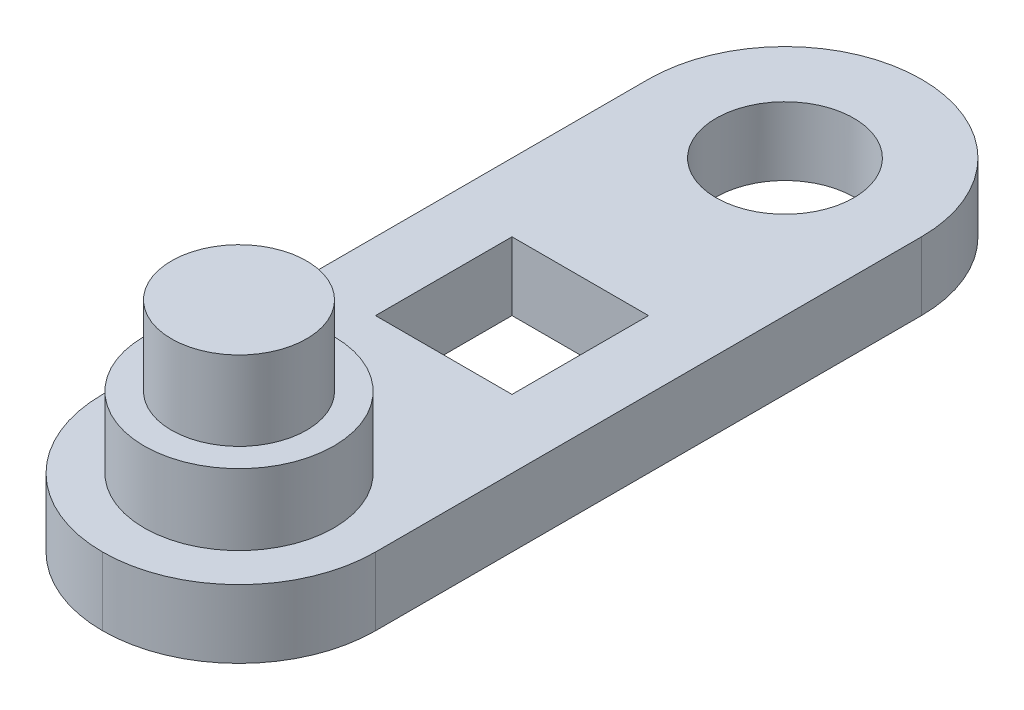
ISO-10303-21;
HEADER;
FILE_DESCRIPTION(('STEP AP214'),'2;1');
FILE_NAME('part.step','',(''),(''),'','','');
FILE_SCHEMA(('AUTOMOTIVE_DESIGN { 1 0 10303 214 1 1 1 1 }'));
ENDSEC;
DATA;
#1=APPLICATION_CONTEXT('core data for automotive mechanical design processes');
#2=APPLICATION_PROTOCOL_DEFINITION('international standard','automotive_design',2000,#1);
#3=PRODUCT_CONTEXT('',#1,'mechanical');
#4=PRODUCT('Part','Part','',(#3));
#5=PRODUCT_RELATED_PRODUCT_CATEGORY('part','',(#4));
#6=PRODUCT_DEFINITION_FORMATION('','',#4);
#7=PRODUCT_DEFINITION_CONTEXT('part definition',#1,'design');
#8=PRODUCT_DEFINITION('design','',#6,#7);
#9=PRODUCT_DEFINITION_SHAPE('','',#8);
#10=(LENGTH_UNIT() NAMED_UNIT(*) SI_UNIT(.MILLI.,.METRE.));
#11=(NAMED_UNIT(*) PLANE_ANGLE_UNIT() SI_UNIT($,.RADIAN.));
#12=(NAMED_UNIT(*) SI_UNIT($,.STERADIAN.) SOLID_ANGLE_UNIT());
#13=UNCERTAINTY_MEASURE_WITH_UNIT(LENGTH_MEASURE(1.E-05),#10,'distance_accuracy_value','');
#14=(GEOMETRIC_REPRESENTATION_CONTEXT(3) GLOBAL_UNCERTAINTY_ASSIGNED_CONTEXT((#13)) GLOBAL_UNIT_ASSIGNED_CONTEXT((#10,
#11,#12)) REPRESENTATION_CONTEXT('',''));
#15=CARTESIAN_POINT('',(0.,0.,0.));
#16=DIRECTION('',(0.,0.,1.));
#17=DIRECTION('',(1.,0.,0.));
#18=AXIS2_PLACEMENT_3D('',#15,#16,#17);
#19=CARTESIAN_POINT('',(-23.3333333333333,5.,-28.974358974359));
#20=DIRECTION('',(1.,0.,0.));
#21=DIRECTION('',(0.,0.,-1.));
#22=AXIS2_PLACEMENT_3D('',#19,#20,#21);
#23=PLANE('',#22);
#24=DIRECTION('',(0.,0.,1.));
#25=VECTOR('',#24,1.);
#26=CARTESIAN_POINT('',(-23.3333333333333,5.,-28.974358974359));
#27=LINE('',#26,#25);
#28=CARTESIAN_POINT('',(-23.3333333333333,5.,-18.974358974359));
#29=VERTEX_POINT('',#28);
#30=CARTESIAN_POINT('',(-23.3333333333333,5.,21.025641025641));
#31=VERTEX_POINT('',#30);
#32=EDGE_CURVE('E157',#29,#31,#27,.T.);
#33=ORIENTED_EDGE('',*,*,#32,.F.);
#34=DIRECTION('',(0.,-1.,0.));
#35=VECTOR('',#34,1.);
#36=CARTESIAN_POINT('',(-23.3333333333333,5.,-18.974358974359));
#37=LINE('',#36,#35);
#38=CARTESIAN_POINT('',(-23.3333333333333,0.,-18.974358974359));
#39=VERTEX_POINT('',#38);
#40=EDGE_CURVE('E173',#29,#39,#37,.T.);
#41=ORIENTED_EDGE('',*,*,#40,.T.);
#42=DIRECTION('',(0.,0.,1.));
#43=VECTOR('',#42,1.);
#44=CARTESIAN_POINT('',(-23.3333333333333,0.,-28.974358974359));
#45=LINE('',#44,#43);
#46=CARTESIAN_POINT('',(-23.3333333333333,0.,21.025641025641));
#47=VERTEX_POINT('',#46);
#48=EDGE_CURVE('E165',#39,#47,#45,.T.);
#49=ORIENTED_EDGE('',*,*,#48,.T.);
#50=DIRECTION('',(0.,-1.,0.));
#51=VECTOR('',#50,1.);
#52=CARTESIAN_POINT('',(-23.3333333333333,5.,21.025641025641));
#53=LINE('',#52,#51);
#54=EDGE_CURVE('E164',#47,#31,#53,.F.);
#55=ORIENTED_EDGE('',*,*,#54,.T.);
#56=EDGE_LOOP('',(#33,#41,#49,#55));
#57=FACE_BOUND('',#56,.T.);
#58=ADVANCED_FACE('F33',(#57),#23,.F.);
#59=CARTESIAN_POINT('',(-3.33333333333331,5.,-28.974358974359));
#60=DIRECTION('',(-1.,0.,0.));
#61=DIRECTION('',(0.,0.,1.));
#62=AXIS2_PLACEMENT_3D('',#59,#60,#61);
#63=PLANE('',#62);
#64=DIRECTION('',(0.,0.,-1.));
#65=VECTOR('',#64,1.);
#66=CARTESIAN_POINT('',(-3.33333333333331,0.,-28.974358974359));
#67=LINE('',#66,#65);
#68=CARTESIAN_POINT('',(-3.3333333333333,0.,21.025641025641));
#69=VERTEX_POINT('',#68);
#70=CARTESIAN_POINT('',(-3.33333333333331,0.,-18.974358974359));
#71=VERTEX_POINT('',#70);
#72=EDGE_CURVE('E161',#69,#71,#67,.T.);
#73=ORIENTED_EDGE('',*,*,#72,.T.);
#74=DIRECTION('',(0.,-1.,0.));
#75=VECTOR('',#74,1.);
#76=CARTESIAN_POINT('',(-3.33333333333331,5.,-18.974358974359));
#77=LINE('',#76,#75);
#78=CARTESIAN_POINT('',(-3.33333333333331,5.,-18.974358974359));
#79=VERTEX_POINT('',#78);
#80=EDGE_CURVE('E41',#71,#79,#77,.F.);
#81=ORIENTED_EDGE('',*,*,#80,.T.);
#82=DIRECTION('',(0.,0.,-1.));
#83=VECTOR('',#82,1.);
#84=CARTESIAN_POINT('',(-3.33333333333331,5.,-28.974358974359));
#85=LINE('',#84,#83);
#86=CARTESIAN_POINT('',(-3.3333333333333,5.,21.025641025641));
#87=VERTEX_POINT('',#86);
#88=EDGE_CURVE('E160',#87,#79,#85,.T.);
#89=ORIENTED_EDGE('',*,*,#88,.F.);
#90=DIRECTION('',(0.,-1.,0.));
#91=VECTOR('',#90,1.);
#92=CARTESIAN_POINT('',(-3.3333333333333,5.,21.025641025641));
#93=LINE('',#92,#91);
#94=EDGE_CURVE('E192',#87,#69,#93,.T.);
#95=ORIENTED_EDGE('',*,*,#94,.T.);
#96=EDGE_LOOP('',(#73,#81,#89,#95));
#97=FACE_BOUND('',#96,.T.);
#98=ADVANCED_FACE('F224',(#97),#63,.F.);
#99=CARTESIAN_POINT('',(0.,5.,0.));
#100=DIRECTION('',(0.,-1.,0.));
#101=DIRECTION('',(0.,0.,-1.));
#102=AXIS2_PLACEMENT_3D('',#99,#100,#101);
#103=PLANE('',#102);
#104=CARTESIAN_POINT('',(-13.3333333333333,5.,21.025641025641));
#105=DIRECTION('',(0.,-1.,0.));
#106=DIRECTION('',(0.,0.,-1.));
#107=AXIS2_PLACEMENT_3D('',#104,#105,#106);
#108=CIRCLE('',#107,6.95);
#109=CARTESIAN_POINT('',(-13.3333333333333,5.,14.075641025641));
#110=VERTEX_POINT('',#109);
#111=EDGE_CURVE('E11',#110,#110,#108,.F.);
#112=ORIENTED_EDGE('',*,*,#111,.F.);
#113=EDGE_LOOP('',(#112));
#114=FACE_BOUND('',#113,.T.);
#115=DIRECTION('',(0.,0.,-1.));
#116=VECTOR('',#115,1.);
#117=CARTESIAN_POINT('',(-8.3333333333333,5.,-3.97435897435897));
#118=LINE('',#117,#116);
#119=CARTESIAN_POINT('',(-8.33333333333329,5.,6.02564102564103));
#120=VERTEX_POINT('',#119);
#121=CARTESIAN_POINT('',(-8.3333333333333,5.,-3.97435897435897));
#122=VERTEX_POINT('',#121);
#123=EDGE_CURVE('E134',#120,#122,#118,.T.);
#124=ORIENTED_EDGE('',*,*,#123,.F.);
#125=DIRECTION('',(1.,0.,0.));
#126=VECTOR('',#125,1.);
#127=CARTESIAN_POINT('',(-18.3333333333333,5.,6.02564102564103));
#128=LINE('',#127,#126);
#129=CARTESIAN_POINT('',(-18.3333333333333,5.,6.02564102564103));
#130=VERTEX_POINT('',#129);
#131=EDGE_CURVE('E127',#130,#120,#128,.T.);
#132=ORIENTED_EDGE('',*,*,#131,.F.);
#133=DIRECTION('',(0.,0.,1.));
#134=VECTOR('',#133,1.);
#135=CARTESIAN_POINT('',(-18.3333333333333,5.,-3.97435897435897));
#136=LINE('',#135,#134);
#137=CARTESIAN_POINT('',(-18.3333333333333,5.,-3.97435897435897));
#138=VERTEX_POINT('',#137);
#139=EDGE_CURVE('E138',#138,#130,#136,.T.);
#140=ORIENTED_EDGE('',*,*,#139,.F.);
#141=DIRECTION('',(-1.,0.,0.));
#142=VECTOR('',#141,1.);
#143=CARTESIAN_POINT('',(-18.3333333333333,5.,-3.97435897435897));
#144=LINE('',#143,#142);
#145=EDGE_CURVE('E48',#122,#138,#144,.T.);
#146=ORIENTED_EDGE('',*,*,#145,.F.);
#147=EDGE_LOOP('',(#124,#132,#140,#146));
#148=FACE_BOUND('',#147,.T.);
#149=CARTESIAN_POINT('',(-13.3333333333333,5.,-18.974358974359));
#150=DIRECTION('',(0.,1.,0.));
#151=DIRECTION('',(0.,0.,1.));
#152=AXIS2_PLACEMENT_3D('',#149,#150,#151);
#153=CIRCLE('',#152,5.05);
#154=CARTESIAN_POINT('',(-13.3333333333333,5.,-13.924358974359));
#155=VERTEX_POINT('',#154);
#156=EDGE_CURVE('E147',#155,#155,#153,.T.);
#157=ORIENTED_EDGE('',*,*,#156,.F.);
#158=EDGE_LOOP('',(#157));
#159=FACE_BOUND('',#158,.T.);
#160=CARTESIAN_POINT('',(-13.3333333333333,5.,-18.974358974359));
#161=DIRECTION('',(0.,-1.,0.));
#162=DIRECTION('',(0.,0.,-1.));
#163=AXIS2_PLACEMENT_3D('',#160,#161,#162);
#164=CIRCLE('',#163,10.);
#165=CARTESIAN_POINT('',(-13.3333333333333,5.,-28.974358974359));
#166=VERTEX_POINT('',#165);
#167=EDGE_CURVE('E188',#79,#166,#164,.F.);
#168=ORIENTED_EDGE('',*,*,#167,.T.);
#169=CARTESIAN_POINT('',(-13.3333333333333,5.,-18.974358974359));
#170=DIRECTION('',(0.,-1.,0.));
#171=DIRECTION('',(0.,0.,-1.));
#172=AXIS2_PLACEMENT_3D('',#169,#170,#171);
#173=CIRCLE('',#172,10.);
#174=EDGE_CURVE('E190',#166,#29,#173,.F.);
#175=ORIENTED_EDGE('',*,*,#174,.T.);
#176=ORIENTED_EDGE('',*,*,#32,.T.);
#177=CARTESIAN_POINT('',(-13.3333333333333,5.,21.025641025641));
#178=DIRECTION('',(0.,-1.,0.));
#179=DIRECTION('',(0.,0.,-1.));
#180=AXIS2_PLACEMENT_3D('',#177,#178,#179);
#181=CIRCLE('',#180,10.);
#182=CARTESIAN_POINT('',(-13.3333333333333,5.,31.025641025641));
#183=VERTEX_POINT('',#182);
#184=EDGE_CURVE('E186',#31,#183,#181,.F.);
#185=ORIENTED_EDGE('',*,*,#184,.T.);
#186=CARTESIAN_POINT('',(-13.3333333333333,5.,21.025641025641));
#187=DIRECTION('',(0.,-1.,0.));
#188=DIRECTION('',(0.,0.,-1.));
#189=AXIS2_PLACEMENT_3D('',#186,#187,#188);
#190=CIRCLE('',#189,10.);
#191=EDGE_CURVE('E184',#183,#87,#190,.F.);
#192=ORIENTED_EDGE('',*,*,#191,.T.);
#193=ORIENTED_EDGE('',*,*,#88,.T.);
#194=EDGE_LOOP('',(#168,#175,#176,#185,#192,#193));
#195=FACE_BOUND('',#194,.T.);
#196=ADVANCED_FACE('F210',(#114,#148,#159,#195),#103,.F.);
#197=CARTESIAN_POINT('',(0.,0.,0.));
#198=DIRECTION('',(0.,-1.,0.));
#199=DIRECTION('',(0.,0.,-1.));
#200=AXIS2_PLACEMENT_3D('',#197,#198,#199);
#201=PLANE('',#200);
#202=DIRECTION('',(1.,0.,0.));
#203=VECTOR('',#202,1.);
#204=CARTESIAN_POINT('',(-18.3333333333333,0.,6.02564102564103));
#205=LINE('',#204,#203);
#206=CARTESIAN_POINT('',(-18.3333333333333,0.,6.02564102564103));
#207=VERTEX_POINT('',#206);
#208=CARTESIAN_POINT('',(-8.33333333333329,0.,6.02564102564103));
#209=VERTEX_POINT('',#208);
#210=EDGE_CURVE('E124',#207,#209,#205,.T.);
#211=ORIENTED_EDGE('',*,*,#210,.T.);
#212=DIRECTION('',(0.,0.,-1.));
#213=VECTOR('',#212,1.);
#214=CARTESIAN_POINT('',(-8.3333333333333,0.,-3.97435897435897));
#215=LINE('',#214,#213);
#216=CARTESIAN_POINT('',(-8.3333333333333,0.,-3.97435897435897));
#217=VERTEX_POINT('',#216);
#218=EDGE_CURVE('E111',#209,#217,#215,.T.);
#219=ORIENTED_EDGE('',*,*,#218,.T.);
#220=DIRECTION('',(-1.,0.,0.));
#221=VECTOR('',#220,1.);
#222=CARTESIAN_POINT('',(-18.3333333333333,0.,-3.97435897435897));
#223=LINE('',#222,#221);
#224=CARTESIAN_POINT('',(-18.3333333333333,0.,-3.97435897435897));
#225=VERTEX_POINT('',#224);
#226=EDGE_CURVE('E142',#217,#225,#223,.T.);
#227=ORIENTED_EDGE('',*,*,#226,.T.);
#228=DIRECTION('',(0.,0.,1.));
#229=VECTOR('',#228,1.);
#230=CARTESIAN_POINT('',(-18.3333333333333,0.,-3.97435897435897));
#231=LINE('',#230,#229);
#232=EDGE_CURVE('E132',#225,#207,#231,.T.);
#233=ORIENTED_EDGE('',*,*,#232,.T.);
#234=EDGE_LOOP('',(#211,#219,#227,#233));
#235=FACE_BOUND('',#234,.T.);
#236=CARTESIAN_POINT('',(-13.3333333333333,0.,-18.974358974359));
#237=DIRECTION('',(0.,-1.,0.));
#238=DIRECTION('',(0.,0.,-1.));
#239=AXIS2_PLACEMENT_3D('',#236,#237,#238);
#240=CIRCLE('',#239,5.05);
#241=CARTESIAN_POINT('',(-13.3333333333333,0.,-24.024358974359));
#242=VERTEX_POINT('',#241);
#243=EDGE_CURVE('E150',#242,#242,#240,.F.);
#244=ORIENTED_EDGE('',*,*,#243,.T.);
#245=EDGE_LOOP('',(#244));
#246=FACE_BOUND('',#245,.T.);
#247=ORIENTED_EDGE('',*,*,#48,.F.);
#248=CARTESIAN_POINT('',(-13.3333333333333,0.,-18.974358974359));
#249=DIRECTION('',(0.,-1.,0.));
#250=DIRECTION('',(0.,0.,-1.));
#251=AXIS2_PLACEMENT_3D('',#248,#249,#250);
#252=CIRCLE('',#251,10.);
#253=CARTESIAN_POINT('',(-13.3333333333333,0.,-28.974358974359));
#254=VERTEX_POINT('',#253);
#255=EDGE_CURVE('E182',#39,#254,#252,.T.);
#256=ORIENTED_EDGE('',*,*,#255,.T.);
#257=CARTESIAN_POINT('',(-13.3333333333333,0.,-18.974358974359));
#258=DIRECTION('',(0.,-1.,0.));
#259=DIRECTION('',(0.,0.,-1.));
#260=AXIS2_PLACEMENT_3D('',#257,#258,#259);
#261=CIRCLE('',#260,10.);
#262=EDGE_CURVE('E180',#254,#71,#261,.T.);
#263=ORIENTED_EDGE('',*,*,#262,.T.);
#264=ORIENTED_EDGE('',*,*,#72,.F.);
#265=CARTESIAN_POINT('',(-13.3333333333333,0.,21.025641025641));
#266=DIRECTION('',(0.,-1.,0.));
#267=DIRECTION('',(0.,0.,-1.));
#268=AXIS2_PLACEMENT_3D('',#265,#266,#267);
#269=CIRCLE('',#268,10.);
#270=CARTESIAN_POINT('',(-13.3333333333333,0.,31.025641025641));
#271=VERTEX_POINT('',#270);
#272=EDGE_CURVE('E176',#69,#271,#269,.T.);
#273=ORIENTED_EDGE('',*,*,#272,.T.);
#274=CARTESIAN_POINT('',(-13.3333333333333,0.,21.025641025641));
#275=DIRECTION('',(0.,-1.,0.));
#276=DIRECTION('',(0.,0.,-1.));
#277=AXIS2_PLACEMENT_3D('',#274,#275,#276);
#278=CIRCLE('',#277,10.);
#279=EDGE_CURVE('E178',#271,#47,#278,.T.);
#280=ORIENTED_EDGE('',*,*,#279,.T.);
#281=EDGE_LOOP('',(#247,#256,#263,#264,#273,#280));
#282=FACE_BOUND('',#281,.T.);
#283=ADVANCED_FACE('F130',(#235,#246,#282),#201,.T.);
#284=CARTESIAN_POINT('',(-13.3333333333333,5.,-18.974358974359));
#285=DIRECTION('',(0.,-1.,0.));
#286=DIRECTION('',(0.,0.,-1.));
#287=AXIS2_PLACEMENT_3D('',#284,#285,#286);
#288=CYLINDRICAL_SURFACE('',#287,10.);
#289=DIRECTION('',(0.,-1.,0.));
#290=VECTOR('',#289,1.);
#291=CARTESIAN_POINT('',(-13.3333333333333,5.,-28.974358974359));
#292=LINE('',#291,#290);
#293=EDGE_CURVE('E168',#166,#254,#292,.T.);
#294=ORIENTED_EDGE('',*,*,#293,.F.);
#295=ORIENTED_EDGE('',*,*,#167,.F.);
#296=ORIENTED_EDGE('',*,*,#80,.F.);
#297=ORIENTED_EDGE('',*,*,#262,.F.);
#298=EDGE_LOOP('',(#294,#295,#296,#297));
#299=FACE_BOUND('',#298,.T.);
#300=ADVANCED_FACE('F238',(#299),#288,.T.);
#301=CARTESIAN_POINT('',(-13.3333333333333,5.,-18.974358974359));
#302=DIRECTION('',(0.,-1.,0.));
#303=DIRECTION('',(0.,0.,-1.));
#304=AXIS2_PLACEMENT_3D('',#301,#302,#303);
#305=CYLINDRICAL_SURFACE('',#304,10.);
#306=ORIENTED_EDGE('',*,*,#174,.F.);
#307=ORIENTED_EDGE('',*,*,#293,.T.);
#308=ORIENTED_EDGE('',*,*,#255,.F.);
#309=ORIENTED_EDGE('',*,*,#40,.F.);
#310=EDGE_LOOP('',(#306,#307,#308,#309));
#311=FACE_BOUND('',#310,.T.);
#312=ADVANCED_FACE('F235',(#311),#305,.T.);
#313=CARTESIAN_POINT('',(-13.3333333333333,5.,21.025641025641));
#314=DIRECTION('',(0.,-1.,0.));
#315=DIRECTION('',(0.,0.,-1.));
#316=AXIS2_PLACEMENT_3D('',#313,#314,#315);
#317=CYLINDRICAL_SURFACE('',#316,10.);
#318=ORIENTED_EDGE('',*,*,#94,.F.);
#319=ORIENTED_EDGE('',*,*,#191,.F.);
#320=DIRECTION('',(0.,-1.,0.));
#321=VECTOR('',#320,1.);
#322=CARTESIAN_POINT('',(-13.3333333333333,5.,31.025641025641));
#323=LINE('',#322,#321);
#324=EDGE_CURVE('E156',#271,#183,#323,.F.);
#325=ORIENTED_EDGE('',*,*,#324,.F.);
#326=ORIENTED_EDGE('',*,*,#272,.F.);
#327=EDGE_LOOP('',(#318,#319,#325,#326));
#328=FACE_BOUND('',#327,.T.);
#329=ADVANCED_FACE('F35',(#328),#317,.T.);
#330=CARTESIAN_POINT('',(-13.3333333333333,5.,21.025641025641));
#331=DIRECTION('',(0.,-1.,0.));
#332=DIRECTION('',(0.,0.,-1.));
#333=AXIS2_PLACEMENT_3D('',#330,#331,#332);
#334=CYLINDRICAL_SURFACE('',#333,10.);
#335=ORIENTED_EDGE('',*,*,#184,.F.);
#336=ORIENTED_EDGE('',*,*,#54,.F.);
#337=ORIENTED_EDGE('',*,*,#279,.F.);
#338=ORIENTED_EDGE('',*,*,#324,.T.);
#339=EDGE_LOOP('',(#335,#336,#337,#338));
#340=FACE_BOUND('',#339,.T.);
#341=ADVANCED_FACE('F242',(#340),#334,.T.);
#342=CARTESIAN_POINT('',(-13.3333333333333,-14.2835569799683,-18.974358974359));
#343=DIRECTION('',(0.,1.,0.));
#344=DIRECTION('',(0.,0.,1.));
#345=AXIS2_PLACEMENT_3D('',#342,#343,#344);
#346=CYLINDRICAL_SURFACE('',#345,5.05);
#347=ORIENTED_EDGE('',*,*,#156,.T.);
#348=EDGE_LOOP('',(#347));
#349=FACE_BOUND('',#348,.T.);
#350=ORIENTED_EDGE('',*,*,#243,.F.);
#351=EDGE_LOOP('',(#350));
#352=FACE_BOUND('',#351,.T.);
#353=ADVANCED_FACE('F244',(#349,#352),#346,.F.);
#354=CARTESIAN_POINT('',(-18.3333333333333,-14.142135623731,6.02564102564103));
#355=DIRECTION('',(0.,0.,1.));
#356=DIRECTION('',(1.,0.,0.));
#357=AXIS2_PLACEMENT_3D('',#354,#355,#356);
#358=PLANE('',#357);
#359=DIRECTION('',(0.,1.,0.));
#360=VECTOR('',#359,1.);
#361=CARTESIAN_POINT('',(-18.3333333333333,-14.142135623731,6.02564102564103));
#362=LINE('',#361,#360);
#363=EDGE_CURVE('E56',#207,#130,#362,.T.);
#364=ORIENTED_EDGE('',*,*,#363,.T.);
#365=ORIENTED_EDGE('',*,*,#131,.T.);
#366=DIRECTION('',(0.,1.,0.));
#367=VECTOR('',#366,1.);
#368=CARTESIAN_POINT('',(-8.33333333333329,-14.142135623731,6.02564102564103));
#369=LINE('',#368,#367);
#370=EDGE_CURVE('E115',#209,#120,#369,.T.);
#371=ORIENTED_EDGE('',*,*,#370,.F.);
#372=ORIENTED_EDGE('',*,*,#210,.F.);
#373=EDGE_LOOP('',(#364,#365,#371,#372));
#374=FACE_BOUND('',#373,.T.);
#375=ADVANCED_FACE('F123',(#374),#358,.F.);
#376=CARTESIAN_POINT('',(-8.3333333333333,-14.142135623731,-3.97435897435897));
#377=DIRECTION('',(1.,0.,0.));
#378=DIRECTION('',(0.,0.,-1.));
#379=AXIS2_PLACEMENT_3D('',#376,#377,#378);
#380=PLANE('',#379);
#381=ORIENTED_EDGE('',*,*,#370,.T.);
#382=ORIENTED_EDGE('',*,*,#123,.T.);
#383=DIRECTION('',(0.,1.,0.));
#384=VECTOR('',#383,1.);
#385=CARTESIAN_POINT('',(-8.3333333333333,-14.142135623731,-3.97435897435897));
#386=LINE('',#385,#384);
#387=EDGE_CURVE('E117',#217,#122,#386,.T.);
#388=ORIENTED_EDGE('',*,*,#387,.F.);
#389=ORIENTED_EDGE('',*,*,#218,.F.);
#390=EDGE_LOOP('',(#381,#382,#388,#389));
#391=FACE_BOUND('',#390,.T.);
#392=ADVANCED_FACE('F113',(#391),#380,.F.);
#393=CARTESIAN_POINT('',(-18.3333333333333,-14.142135623731,-3.97435897435897));
#394=DIRECTION('',(0.,0.,-1.));
#395=DIRECTION('',(-1.,0.,0.));
#396=AXIS2_PLACEMENT_3D('',#393,#394,#395);
#397=PLANE('',#396);
#398=ORIENTED_EDGE('',*,*,#387,.T.);
#399=ORIENTED_EDGE('',*,*,#145,.T.);
#400=DIRECTION('',(0.,1.,0.));
#401=VECTOR('',#400,1.);
#402=CARTESIAN_POINT('',(-18.3333333333333,-14.142135623731,-3.97435897435897));
#403=LINE('',#402,#401);
#404=EDGE_CURVE('E141',#225,#138,#403,.T.);
#405=ORIENTED_EDGE('',*,*,#404,.F.);
#406=ORIENTED_EDGE('',*,*,#226,.F.);
#407=EDGE_LOOP('',(#398,#399,#405,#406));
#408=FACE_BOUND('',#407,.T.);
#409=ADVANCED_FACE('F213',(#408),#397,.F.);
#410=CARTESIAN_POINT('',(-18.3333333333333,-14.142135623731,-3.97435897435897));
#411=DIRECTION('',(-1.,0.,0.));
#412=DIRECTION('',(0.,0.,1.));
#413=AXIS2_PLACEMENT_3D('',#410,#411,#412);
#414=PLANE('',#413);
#415=ORIENTED_EDGE('',*,*,#404,.T.);
#416=ORIENTED_EDGE('',*,*,#139,.T.);
#417=ORIENTED_EDGE('',*,*,#363,.F.);
#418=ORIENTED_EDGE('',*,*,#232,.F.);
#419=EDGE_LOOP('',(#415,#416,#417,#418));
#420=FACE_BOUND('',#419,.T.);
#421=ADVANCED_FACE('F212',(#420),#414,.F.);
#422=CARTESIAN_POINT('',(-13.3333333333333,10.2,21.025641025641));
#423=DIRECTION('',(0.,-1.,0.));
#424=DIRECTION('',(0.,0.,-1.));
#425=AXIS2_PLACEMENT_3D('',#422,#423,#424);
#426=CYLINDRICAL_SURFACE('',#425,6.95);
#427=CARTESIAN_POINT('',(-13.3333333333333,10.2,21.025641025641));
#428=DIRECTION('',(0.,1.,0.));
#429=DIRECTION('',(0.,0.,1.));
#430=AXIS2_PLACEMENT_3D('',#427,#428,#429);
#431=CIRCLE('',#430,6.95);
#432=CARTESIAN_POINT('',(-13.3333333333333,10.2,27.975641025641));
#433=VERTEX_POINT('',#432);
#434=EDGE_CURVE('E200',#433,#433,#431,.T.);
#435=ORIENTED_EDGE('',*,*,#434,.F.);
#436=EDGE_LOOP('',(#435));
#437=FACE_BOUND('',#436,.T.);
#438=ORIENTED_EDGE('',*,*,#111,.T.);
#439=EDGE_LOOP('',(#438));
#440=FACE_BOUND('',#439,.T.);
#441=ADVANCED_FACE('F220',(#437,#440),#426,.T.);
#442=CARTESIAN_POINT('',(-13.3333333333333,10.2,21.025641025641));
#443=DIRECTION('',(0.,1.,0.));
#444=DIRECTION('',(0.,0.,1.));
#445=AXIS2_PLACEMENT_3D('',#442,#443,#444);
#446=PLANE('',#445);
#447=CARTESIAN_POINT('',(-13.3333333333333,10.2,21.025641025641));
#448=DIRECTION('',(0.,1.,0.));
#449=DIRECTION('',(0.,0.,1.));
#450=AXIS2_PLACEMENT_3D('',#447,#448,#449);
#451=CIRCLE('',#450,4.95);
#452=CARTESIAN_POINT('',(-13.3333333333333,10.2,25.975641025641));
#453=VERTEX_POINT('',#452);
#454=EDGE_CURVE('E198',#453,#453,#451,.T.);
#455=ORIENTED_EDGE('',*,*,#454,.F.);
#456=EDGE_LOOP('',(#455));
#457=FACE_BOUND('',#456,.T.);
#458=ORIENTED_EDGE('',*,*,#434,.T.);
#459=EDGE_LOOP('',(#458));
#460=FACE_BOUND('',#459,.T.);
#461=ADVANCED_FACE('F282',(#457,#460),#446,.T.);
#462=CARTESIAN_POINT('',(-13.3333333333333,16.,21.025641025641));
#463=DIRECTION('',(0.,1.,0.));
#464=DIRECTION('',(0.,0.,1.));
#465=AXIS2_PLACEMENT_3D('',#462,#463,#464);
#466=PLANE('',#465);
#467=CARTESIAN_POINT('',(-13.3333333333333,16.,21.025641025641));
#468=DIRECTION('',(0.,1.,0.));
#469=DIRECTION('',(0.,0.,1.));
#470=AXIS2_PLACEMENT_3D('',#467,#468,#469);
#471=CIRCLE('',#470,4.95);
#472=CARTESIAN_POINT('',(-13.3333333333333,16.,25.975641025641));
#473=VERTEX_POINT('',#472);
#474=EDGE_CURVE('E153',#473,#473,#471,.T.);
#475=ORIENTED_EDGE('',*,*,#474,.T.);
#476=EDGE_LOOP('',(#475));
#477=FACE_BOUND('',#476,.T.);
#478=ADVANCED_FACE('F280',(#477),#466,.T.);
#479=CARTESIAN_POINT('',(-13.3333333333333,16.,21.025641025641));
#480=DIRECTION('',(0.,-1.,0.));
#481=DIRECTION('',(0.,0.,-1.));
#482=AXIS2_PLACEMENT_3D('',#479,#480,#481);
#483=CYLINDRICAL_SURFACE('',#482,4.95);
#484=ORIENTED_EDGE('',*,*,#454,.T.);
#485=EDGE_LOOP('',(#484));
#486=FACE_BOUND('',#485,.T.);
#487=ORIENTED_EDGE('',*,*,#474,.F.);
#488=EDGE_LOOP('',(#487));
#489=FACE_BOUND('',#488,.T.);
#490=ADVANCED_FACE('F277',(#486,#489),#483,.T.);
#491=CLOSED_SHELL('',(#58,#98,#196,#283,#300,#312,#329,#341,#353,#375,#392,#409,#421,#441,#461,
#478,#490));
#492=MANIFOLD_SOLID_BREP('B2',#491);
#493=ADVANCED_BREP_SHAPE_REPRESENTATION('',(#18,#492),#14);
#494=SHAPE_DEFINITION_REPRESENTATION(#9,#493);
ENDSEC;
END-ISO-10303-21;
